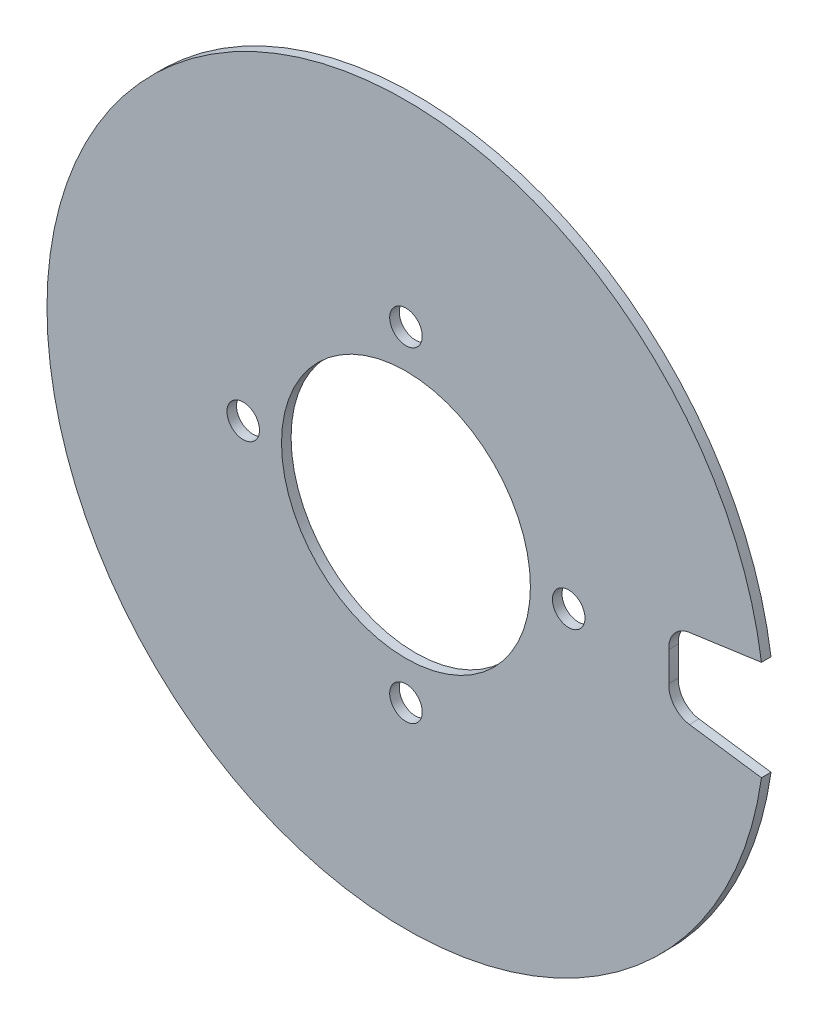
ISO-10303-21;
HEADER;
FILE_DESCRIPTION(('STEP AP214'),'2;1');
FILE_NAME('part.step','',(''),(''),'','','');
FILE_SCHEMA(('AUTOMOTIVE_DESIGN { 1 0 10303 214 1 1 1 1 }'));
ENDSEC;
DATA;
#1=APPLICATION_CONTEXT('core data for automotive mechanical design processes');
#2=APPLICATION_PROTOCOL_DEFINITION('international standard','automotive_design',2000,#1);
#3=PRODUCT_CONTEXT('',#1,'mechanical');
#4=PRODUCT('Part','Part','',(#3));
#5=PRODUCT_RELATED_PRODUCT_CATEGORY('part','',(#4));
#6=PRODUCT_DEFINITION_FORMATION('','',#4);
#7=PRODUCT_DEFINITION_CONTEXT('part definition',#1,'design');
#8=PRODUCT_DEFINITION('design','',#6,#7);
#9=PRODUCT_DEFINITION_SHAPE('','',#8);
#10=(LENGTH_UNIT() NAMED_UNIT(*) SI_UNIT(.MILLI.,.METRE.));
#11=(NAMED_UNIT(*) PLANE_ANGLE_UNIT() SI_UNIT($,.RADIAN.));
#12=(NAMED_UNIT(*) SI_UNIT($,.STERADIAN.) SOLID_ANGLE_UNIT());
#13=UNCERTAINTY_MEASURE_WITH_UNIT(LENGTH_MEASURE(1.E-05),#10,'distance_accuracy_value','');
#14=(GEOMETRIC_REPRESENTATION_CONTEXT(3) GLOBAL_UNCERTAINTY_ASSIGNED_CONTEXT((#13)) GLOBAL_UNIT_ASSIGNED_CONTEXT((#10,
#11,#12)) REPRESENTATION_CONTEXT('',''));
#15=CARTESIAN_POINT('',(0.,0.,0.));
#16=DIRECTION('',(0.,0.,1.));
#17=DIRECTION('',(1.,0.,0.));
#18=AXIS2_PLACEMENT_3D('',#15,#16,#17);
#19=CARTESIAN_POINT('',(0.,0.,1.));
#20=DIRECTION('',(0.,0.,-1.));
#21=DIRECTION('',(-1.,0.,0.));
#22=AXIS2_PLACEMENT_3D('',#19,#20,#21);
#23=CYLINDRICAL_SURFACE('',#22,37.5);
#24=CARTESIAN_POINT('',(0.,0.,0.));
#25=DIRECTION('',(0.,0.,1.));
#26=DIRECTION('',(1.,0.,0.));
#27=AXIS2_PLACEMENT_3D('',#24,#25,#26);
#28=CIRCLE('',#27,37.5);
#29=CARTESIAN_POINT('',(37.1350525778089,5.21899128600247,0.));
#30=VERTEX_POINT('',#29);
#31=CARTESIAN_POINT('',(37.1350525778089,-5.21899128600246,0.));
#32=VERTEX_POINT('',#31);
#33=EDGE_CURVE('E107',#30,#32,#28,.T.);
#34=ORIENTED_EDGE('',*,*,#33,.T.);
#35=DIRECTION('',(0.,0.,1.));
#36=VECTOR('',#35,1.);
#37=CARTESIAN_POINT('',(37.1350525778089,-5.21899128600246,0.));
#38=LINE('',#37,#36);
#39=CARTESIAN_POINT('',(37.1350525778089,-5.21899128600246,1.));
#40=VERTEX_POINT('',#39);
#41=EDGE_CURVE('E111',#32,#40,#38,.T.);
#42=ORIENTED_EDGE('',*,*,#41,.T.);
#43=CARTESIAN_POINT('',(0.,0.,1.));
#44=DIRECTION('',(0.,0.,1.));
#45=DIRECTION('',(1.,0.,0.));
#46=AXIS2_PLACEMENT_3D('',#43,#44,#45);
#47=CIRCLE('',#46,37.5);
#48=CARTESIAN_POINT('',(37.1350525778089,5.21899128600247,1.));
#49=VERTEX_POINT('',#48);
#50=EDGE_CURVE('E109',#49,#40,#47,.T.);
#51=ORIENTED_EDGE('',*,*,#50,.F.);
#52=DIRECTION('',(0.,0.,1.));
#53=VECTOR('',#52,1.);
#54=CARTESIAN_POINT('',(37.1350525778089,5.21899128600247,0.));
#55=LINE('',#54,#53);
#56=EDGE_CURVE('E95',#30,#49,#55,.T.);
#57=ORIENTED_EDGE('',*,*,#56,.F.);
#58=EDGE_LOOP('',(#34,#42,#51,#57));
#59=FACE_BOUND('',#58,.T.);
#60=ADVANCED_FACE('F42',(#59),#23,.T.);
#61=CARTESIAN_POINT('',(0.,0.,1.));
#62=DIRECTION('',(0.,0.,1.));
#63=DIRECTION('',(1.,0.,0.));
#64=AXIS2_PLACEMENT_3D('',#61,#62,#63);
#65=PLANE('',#64);
#66=DIRECTION('',(0.99026806874157,-0.139173100960066,0.));
#67=VECTOR('',#66,1.);
#68=CARTESIAN_POINT('',(27.2323718903932,-3.82726027640181,1.));
#69=LINE('',#68,#67);
#70=CARTESIAN_POINT('',(29.6047094289479,-4.1606705742661,1.));
#71=VERTEX_POINT('',#70);
#72=EDGE_CURVE('E101',#71,#40,#69,.T.);
#73=ORIENTED_EDGE('',*,*,#72,.F.);
#74=CARTESIAN_POINT('',(29.9526421813481,-1.68500040241218,1.));
#75=DIRECTION('',(0.,0.,1.));
#76=DIRECTION('',(1.,0.,0.));
#77=AXIS2_PLACEMENT_3D('',#74,#75,#76);
#78=CIRCLE('',#77,2.5);
#79=CARTESIAN_POINT('',(27.4565886662357,-1.54458370221116,1.));
#80=VERTEX_POINT('',#79);
#81=EDGE_CURVE('E141',#71,#80,#78,.F.);
#82=ORIENTED_EDGE('',*,*,#81,.T.);
#83=CARTESIAN_POINT('',(0.,0.,1.));
#84=DIRECTION('',(0.,0.,-1.));
#85=DIRECTION('',(1.,0.,0.));
#86=AXIS2_PLACEMENT_3D('',#83,#84,#85);
#87=CIRCLE('',#86,27.5);
#88=CARTESIAN_POINT('',(27.4565886662357,1.54458370221117,1.));
#89=VERTEX_POINT('',#88);
#90=EDGE_CURVE('E162',#89,#80,#87,.T.);
#91=ORIENTED_EDGE('',*,*,#90,.F.);
#92=CARTESIAN_POINT('',(29.9526421813481,1.68500040241218,1.));
#93=DIRECTION('',(0.,0.,1.));
#94=DIRECTION('',(1.,0.,0.));
#95=AXIS2_PLACEMENT_3D('',#92,#93,#94);
#96=CIRCLE('',#95,2.5);
#97=CARTESIAN_POINT('',(29.6047094289479,4.16067057426611,1.));
#98=VERTEX_POINT('',#97);
#99=EDGE_CURVE('E51',#89,#98,#96,.F.);
#100=ORIENTED_EDGE('',*,*,#99,.T.);
#101=DIRECTION('',(-0.99026806874157,-0.139173100960066,0.));
#102=VECTOR('',#101,1.);
#103=CARTESIAN_POINT('',(27.2323718903932,3.82726027640181,1.));
#104=LINE('',#103,#102);
#105=EDGE_CURVE('E167',#49,#98,#104,.T.);
#106=ORIENTED_EDGE('',*,*,#105,.F.);
#107=ORIENTED_EDGE('',*,*,#50,.T.);
#108=EDGE_LOOP('',(#73,#82,#91,#100,#106,#107));
#109=FACE_BOUND('',#108,.T.);
#110=CARTESIAN_POINT('',(0.,17.,1.));
#111=DIRECTION('',(0.,0.,1.));
#112=DIRECTION('',(1.,0.,0.));
#113=AXIS2_PLACEMENT_3D('',#110,#111,#112);
#114=CIRCLE('',#113,1.69999999999999);
#115=CARTESIAN_POINT('',(1.69999999999999,17.,1.));
#116=VERTEX_POINT('',#115);
#117=EDGE_CURVE('E175',#116,#116,#114,.T.);
#118=ORIENTED_EDGE('',*,*,#117,.F.);
#119=EDGE_LOOP('',(#118));
#120=FACE_BOUND('',#119,.T.);
#121=CARTESIAN_POINT('',(17.,0.,1.));
#122=DIRECTION('',(0.,0.,1.));
#123=DIRECTION('',(1.,0.,0.));
#124=AXIS2_PLACEMENT_3D('',#121,#122,#123);
#125=CIRCLE('',#124,1.69999999999999);
#126=CARTESIAN_POINT('',(18.7,0.,1.));
#127=VERTEX_POINT('',#126);
#128=EDGE_CURVE('E184',#127,#127,#125,.T.);
#129=ORIENTED_EDGE('',*,*,#128,.F.);
#130=EDGE_LOOP('',(#129));
#131=FACE_BOUND('',#130,.T.);
#132=CARTESIAN_POINT('',(0.,-17.,1.));
#133=DIRECTION('',(0.,0.,1.));
#134=DIRECTION('',(1.,0.,0.));
#135=AXIS2_PLACEMENT_3D('',#132,#133,#134);
#136=CIRCLE('',#135,1.69999999999999);
#137=CARTESIAN_POINT('',(1.69999999999999,-17.,1.));
#138=VERTEX_POINT('',#137);
#139=EDGE_CURVE('E192',#138,#138,#136,.T.);
#140=ORIENTED_EDGE('',*,*,#139,.F.);
#141=EDGE_LOOP('',(#140));
#142=FACE_BOUND('',#141,.T.);
#143=CARTESIAN_POINT('',(-17.,0.,1.));
#144=DIRECTION('',(0.,0.,1.));
#145=DIRECTION('',(1.,0.,0.));
#146=AXIS2_PLACEMENT_3D('',#143,#144,#145);
#147=CIRCLE('',#146,1.69999999999999);
#148=CARTESIAN_POINT('',(-15.3,0.,1.));
#149=VERTEX_POINT('',#148);
#150=EDGE_CURVE('E200',#149,#149,#147,.T.);
#151=ORIENTED_EDGE('',*,*,#150,.F.);
#152=EDGE_LOOP('',(#151));
#153=FACE_BOUND('',#152,.T.);
#154=CARTESIAN_POINT('',(0.,0.,1.));
#155=DIRECTION('',(0.,0.,1.));
#156=DIRECTION('',(1.,0.,0.));
#157=AXIS2_PLACEMENT_3D('',#154,#155,#156);
#158=CIRCLE('',#157,13.);
#159=CARTESIAN_POINT('',(13.,0.,1.));
#160=VERTEX_POINT('',#159);
#161=EDGE_CURVE('E125',#160,#160,#158,.T.);
#162=ORIENTED_EDGE('',*,*,#161,.F.);
#163=EDGE_LOOP('',(#162));
#164=FACE_BOUND('',#163,.T.);
#165=ADVANCED_FACE('F160',(#109,#120,#131,#142,#153,#164),#65,.T.);
#166=CARTESIAN_POINT('',(0.,0.,0.));
#167=DIRECTION('',(0.,0.,1.));
#168=DIRECTION('',(1.,0.,0.));
#169=AXIS2_PLACEMENT_3D('',#166,#167,#168);
#170=PLANE('',#169);
#171=CARTESIAN_POINT('',(0.,17.,0.));
#172=DIRECTION('',(0.,0.,1.));
#173=DIRECTION('',(1.,0.,0.));
#174=AXIS2_PLACEMENT_3D('',#171,#172,#173);
#175=CIRCLE('',#174,1.7);
#176=CARTESIAN_POINT('',(1.7,17.,0.));
#177=VERTEX_POINT('',#176);
#178=EDGE_CURVE('E180',#177,#177,#175,.T.);
#179=ORIENTED_EDGE('',*,*,#178,.T.);
#180=EDGE_LOOP('',(#179));
#181=FACE_BOUND('',#180,.T.);
#182=CARTESIAN_POINT('',(17.,0.,0.));
#183=DIRECTION('',(0.,0.,1.));
#184=DIRECTION('',(1.,0.,0.));
#185=AXIS2_PLACEMENT_3D('',#182,#183,#184);
#186=CIRCLE('',#185,1.7);
#187=CARTESIAN_POINT('',(18.7,0.,0.));
#188=VERTEX_POINT('',#187);
#189=EDGE_CURVE('E188',#188,#188,#186,.T.);
#190=ORIENTED_EDGE('',*,*,#189,.T.);
#191=EDGE_LOOP('',(#190));
#192=FACE_BOUND('',#191,.T.);
#193=CARTESIAN_POINT('',(0.,-17.,0.));
#194=DIRECTION('',(0.,0.,1.));
#195=DIRECTION('',(1.,0.,0.));
#196=AXIS2_PLACEMENT_3D('',#193,#194,#195);
#197=CIRCLE('',#196,1.7);
#198=CARTESIAN_POINT('',(1.7,-17.,0.));
#199=VERTEX_POINT('',#198);
#200=EDGE_CURVE('E196',#199,#199,#197,.T.);
#201=ORIENTED_EDGE('',*,*,#200,.T.);
#202=EDGE_LOOP('',(#201));
#203=FACE_BOUND('',#202,.T.);
#204=CARTESIAN_POINT('',(-17.,0.,0.));
#205=DIRECTION('',(0.,0.,1.));
#206=DIRECTION('',(1.,0.,0.));
#207=AXIS2_PLACEMENT_3D('',#204,#205,#206);
#208=CIRCLE('',#207,1.7);
#209=CARTESIAN_POINT('',(-15.3,0.,0.));
#210=VERTEX_POINT('',#209);
#211=EDGE_CURVE('E204',#210,#210,#208,.T.);
#212=ORIENTED_EDGE('',*,*,#211,.T.);
#213=EDGE_LOOP('',(#212));
#214=FACE_BOUND('',#213,.T.);
#215=CARTESIAN_POINT('',(0.,0.,0.));
#216=DIRECTION('',(0.,0.,1.));
#217=DIRECTION('',(1.,0.,0.));
#218=AXIS2_PLACEMENT_3D('',#215,#216,#217);
#219=CIRCLE('',#218,13.);
#220=CARTESIAN_POINT('',(13.,0.,0.));
#221=VERTEX_POINT('',#220);
#222=EDGE_CURVE('E118',#221,#221,#219,.T.);
#223=ORIENTED_EDGE('',*,*,#222,.T.);
#224=EDGE_LOOP('',(#223));
#225=FACE_BOUND('',#224,.T.);
#226=DIRECTION('',(-0.99026806874157,-0.139173100960066,0.));
#227=VECTOR('',#226,1.);
#228=CARTESIAN_POINT('',(27.2323718903932,3.82726027640181,0.));
#229=LINE('',#228,#227);
#230=CARTESIAN_POINT('',(29.6047094289479,4.16067057426611,0.));
#231=VERTEX_POINT('',#230);
#232=EDGE_CURVE('E92',#30,#231,#229,.T.);
#233=ORIENTED_EDGE('',*,*,#232,.T.);
#234=CARTESIAN_POINT('',(29.9526421813481,1.68500040241218,0.));
#235=DIRECTION('',(0.,0.,1.));
#236=DIRECTION('',(1.,0.,0.));
#237=AXIS2_PLACEMENT_3D('',#234,#235,#236);
#238=CIRCLE('',#237,2.5);
#239=CARTESIAN_POINT('',(27.4565886662357,1.54458370221117,0.));
#240=VERTEX_POINT('',#239);
#241=EDGE_CURVE('E11',#231,#240,#238,.T.);
#242=ORIENTED_EDGE('',*,*,#241,.T.);
#243=CARTESIAN_POINT('',(0.,0.,0.));
#244=DIRECTION('',(0.,0.,-1.));
#245=DIRECTION('',(1.,0.,0.));
#246=AXIS2_PLACEMENT_3D('',#243,#244,#245);
#247=CIRCLE('',#246,27.5);
#248=CARTESIAN_POINT('',(27.4565886662357,-1.54458370221116,0.));
#249=VERTEX_POINT('',#248);
#250=EDGE_CURVE('E100',#240,#249,#247,.T.);
#251=ORIENTED_EDGE('',*,*,#250,.T.);
#252=CARTESIAN_POINT('',(29.9526421813481,-1.68500040241218,0.));
#253=DIRECTION('',(0.,0.,1.));
#254=DIRECTION('',(1.,0.,0.));
#255=AXIS2_PLACEMENT_3D('',#252,#253,#254);
#256=CIRCLE('',#255,2.5);
#257=CARTESIAN_POINT('',(29.6047094289479,-4.1606705742661,0.));
#258=VERTEX_POINT('',#257);
#259=EDGE_CURVE('E144',#249,#258,#256,.T.);
#260=ORIENTED_EDGE('',*,*,#259,.T.);
#261=DIRECTION('',(0.99026806874157,-0.139173100960066,0.));
#262=VECTOR('',#261,1.);
#263=CARTESIAN_POINT('',(27.2323718903932,-3.82726027640181,0.));
#264=LINE('',#263,#262);
#265=EDGE_CURVE('E112',#258,#32,#264,.T.);
#266=ORIENTED_EDGE('',*,*,#265,.T.);
#267=ORIENTED_EDGE('',*,*,#33,.F.);
#268=EDGE_LOOP('',(#233,#242,#251,#260,#266,#267));
#269=FACE_BOUND('',#268,.T.);
#270=ADVANCED_FACE('F114',(#181,#192,#203,#214,#225,#269),#170,.F.);
#271=CARTESIAN_POINT('',(0.,0.,0.));
#272=DIRECTION('',(0.,0.,1.));
#273=DIRECTION('',(1.,0.,0.));
#274=AXIS2_PLACEMENT_3D('',#271,#272,#273);
#275=CYLINDRICAL_SURFACE('',#274,13.);
#276=ORIENTED_EDGE('',*,*,#222,.F.);
#277=EDGE_LOOP('',(#276));
#278=FACE_BOUND('',#277,.T.);
#279=ORIENTED_EDGE('',*,*,#161,.T.);
#280=EDGE_LOOP('',(#279));
#281=FACE_BOUND('',#280,.T.);
#282=ADVANCED_FACE('F211',(#278,#281),#275,.F.);
#283=CARTESIAN_POINT('',(-17.,0.,1.));
#284=DIRECTION('',(0.,0.,1.));
#285=DIRECTION('',(1.,0.,0.));
#286=AXIS2_PLACEMENT_3D('',#283,#284,#285);
#287=CYLINDRICAL_SURFACE('',#286,1.69999999999999);
#288=ORIENTED_EDGE('',*,*,#211,.F.);
#289=EDGE_LOOP('',(#288));
#290=FACE_BOUND('',#289,.T.);
#291=ORIENTED_EDGE('',*,*,#150,.T.);
#292=EDGE_LOOP('',(#291));
#293=FACE_BOUND('',#292,.T.);
#294=ADVANCED_FACE('F247',(#290,#293),#287,.F.);
#295=CARTESIAN_POINT('',(0.,-17.,1.));
#296=DIRECTION('',(0.,0.,1.));
#297=DIRECTION('',(1.,0.,0.));
#298=AXIS2_PLACEMENT_3D('',#295,#296,#297);
#299=CYLINDRICAL_SURFACE('',#298,1.69999999999999);
#300=ORIENTED_EDGE('',*,*,#200,.F.);
#301=EDGE_LOOP('',(#300));
#302=FACE_BOUND('',#301,.T.);
#303=ORIENTED_EDGE('',*,*,#139,.T.);
#304=EDGE_LOOP('',(#303));
#305=FACE_BOUND('',#304,.T.);
#306=ADVANCED_FACE('F244',(#302,#305),#299,.F.);
#307=CARTESIAN_POINT('',(17.,0.,1.));
#308=DIRECTION('',(0.,0.,1.));
#309=DIRECTION('',(1.,0.,0.));
#310=AXIS2_PLACEMENT_3D('',#307,#308,#309);
#311=CYLINDRICAL_SURFACE('',#310,1.69999999999999);
#312=ORIENTED_EDGE('',*,*,#189,.F.);
#313=EDGE_LOOP('',(#312));
#314=FACE_BOUND('',#313,.T.);
#315=ORIENTED_EDGE('',*,*,#128,.T.);
#316=EDGE_LOOP('',(#315));
#317=FACE_BOUND('',#316,.T.);
#318=ADVANCED_FACE('F240',(#314,#317),#311,.F.);
#319=CARTESIAN_POINT('',(0.,17.,1.));
#320=DIRECTION('',(0.,0.,1.));
#321=DIRECTION('',(1.,0.,0.));
#322=AXIS2_PLACEMENT_3D('',#319,#320,#321);
#323=CYLINDRICAL_SURFACE('',#322,1.69999999999999);
#324=ORIENTED_EDGE('',*,*,#178,.F.);
#325=EDGE_LOOP('',(#324));
#326=FACE_BOUND('',#325,.T.);
#327=ORIENTED_EDGE('',*,*,#117,.T.);
#328=EDGE_LOOP('',(#327));
#329=FACE_BOUND('',#328,.T.);
#330=ADVANCED_FACE('F237',(#326,#329),#323,.F.);
#331=CARTESIAN_POINT('',(27.2323718903932,-3.82726027640181,0.));
#332=DIRECTION('',(-0.139173100960066,-0.99026806874157,0.));
#333=DIRECTION('',(0.99026806874157,-0.139173100960066,0.));
#334=AXIS2_PLACEMENT_3D('',#331,#332,#333);
#335=PLANE('',#334);
#336=ORIENTED_EDGE('',*,*,#265,.F.);
#337=DIRECTION('',(0.,0.,-1.));
#338=VECTOR('',#337,1.);
#339=CARTESIAN_POINT('',(29.6047094289479,-4.1606705742661,1.));
#340=LINE('',#339,#338);
#341=EDGE_CURVE('E122',#258,#71,#340,.F.);
#342=ORIENTED_EDGE('',*,*,#341,.T.);
#343=ORIENTED_EDGE('',*,*,#72,.T.);
#344=ORIENTED_EDGE('',*,*,#41,.F.);
#345=EDGE_LOOP('',(#336,#342,#343,#344));
#346=FACE_BOUND('',#345,.T.);
#347=ADVANCED_FACE('F154',(#346),#335,.F.);
#348=CARTESIAN_POINT('',(0.,0.,0.));
#349=DIRECTION('',(0.,0.,1.));
#350=DIRECTION('',(1.,0.,0.));
#351=AXIS2_PLACEMENT_3D('',#348,#349,#350);
#352=CYLINDRICAL_SURFACE('',#351,27.5);
#353=ORIENTED_EDGE('',*,*,#90,.T.);
#354=DIRECTION('',(0.,0.,1.));
#355=VECTOR('',#354,1.);
#356=CARTESIAN_POINT('',(27.4565886662357,-1.54458370221116,0.));
#357=LINE('',#356,#355);
#358=EDGE_CURVE('E136',#80,#249,#357,.F.);
#359=ORIENTED_EDGE('',*,*,#358,.T.);
#360=ORIENTED_EDGE('',*,*,#250,.F.);
#361=DIRECTION('',(0.,0.,1.));
#362=VECTOR('',#361,1.);
#363=CARTESIAN_POINT('',(27.4565886662357,1.54458370221117,0.));
#364=LINE('',#363,#362);
#365=EDGE_CURVE('E132',#240,#89,#364,.T.);
#366=ORIENTED_EDGE('',*,*,#365,.T.);
#367=EDGE_LOOP('',(#353,#359,#360,#366));
#368=FACE_BOUND('',#367,.T.);
#369=ADVANCED_FACE('F164',(#368),#352,.T.);
#370=CARTESIAN_POINT('',(27.2323718903932,3.82726027640181,0.));
#371=DIRECTION('',(-0.139173100960066,0.99026806874157,0.));
#372=DIRECTION('',(-0.99026806874157,-0.139173100960066,0.));
#373=AXIS2_PLACEMENT_3D('',#370,#371,#372);
#374=PLANE('',#373);
#375=ORIENTED_EDGE('',*,*,#105,.T.);
#376=DIRECTION('',(0.,0.,-1.));
#377=VECTOR('',#376,1.);
#378=CARTESIAN_POINT('',(29.6047094289479,4.16067057426611,0.));
#379=LINE('',#378,#377);
#380=EDGE_CURVE('E58',#98,#231,#379,.T.);
#381=ORIENTED_EDGE('',*,*,#380,.T.);
#382=ORIENTED_EDGE('',*,*,#232,.F.);
#383=ORIENTED_EDGE('',*,*,#56,.T.);
#384=EDGE_LOOP('',(#375,#381,#382,#383));
#385=FACE_BOUND('',#384,.T.);
#386=ADVANCED_FACE('F94',(#385),#374,.F.);
#387=CARTESIAN_POINT('',(29.9526421813481,-1.68500040241218,0.));
#388=DIRECTION('',(0.,0.,1.));
#389=DIRECTION('',(1.,0.,0.));
#390=AXIS2_PLACEMENT_3D('',#387,#388,#389);
#391=CYLINDRICAL_SURFACE('',#390,2.5);
#392=ORIENTED_EDGE('',*,*,#259,.F.);
#393=ORIENTED_EDGE('',*,*,#358,.F.);
#394=ORIENTED_EDGE('',*,*,#81,.F.);
#395=ORIENTED_EDGE('',*,*,#341,.F.);
#396=EDGE_LOOP('',(#392,#393,#394,#395));
#397=FACE_BOUND('',#396,.T.);
#398=ADVANCED_FACE('F158',(#397),#391,.F.);
#399=CARTESIAN_POINT('',(29.9526421813481,1.68500040241218,0.));
#400=DIRECTION('',(0.,0.,1.));
#401=DIRECTION('',(1.,0.,0.));
#402=AXIS2_PLACEMENT_3D('',#399,#400,#401);
#403=CYLINDRICAL_SURFACE('',#402,2.5);
#404=ORIENTED_EDGE('',*,*,#241,.F.);
#405=ORIENTED_EDGE('',*,*,#380,.F.);
#406=ORIENTED_EDGE('',*,*,#99,.F.);
#407=ORIENTED_EDGE('',*,*,#365,.F.);
#408=EDGE_LOOP('',(#404,#405,#406,#407));
#409=FACE_BOUND('',#408,.T.);
#410=ADVANCED_FACE('F44',(#409),#403,.F.);
#411=CLOSED_SHELL('',(#60,#165,#270,#282,#294,#306,#318,#330,#347,#369,#386,#398,#410));
#412=MANIFOLD_SOLID_BREP('B2',#411);
#413=ADVANCED_BREP_SHAPE_REPRESENTATION('',(#18,#412),#14);
#414=SHAPE_DEFINITION_REPRESENTATION(#9,#413);
ENDSEC;
END-ISO-10303-21;
